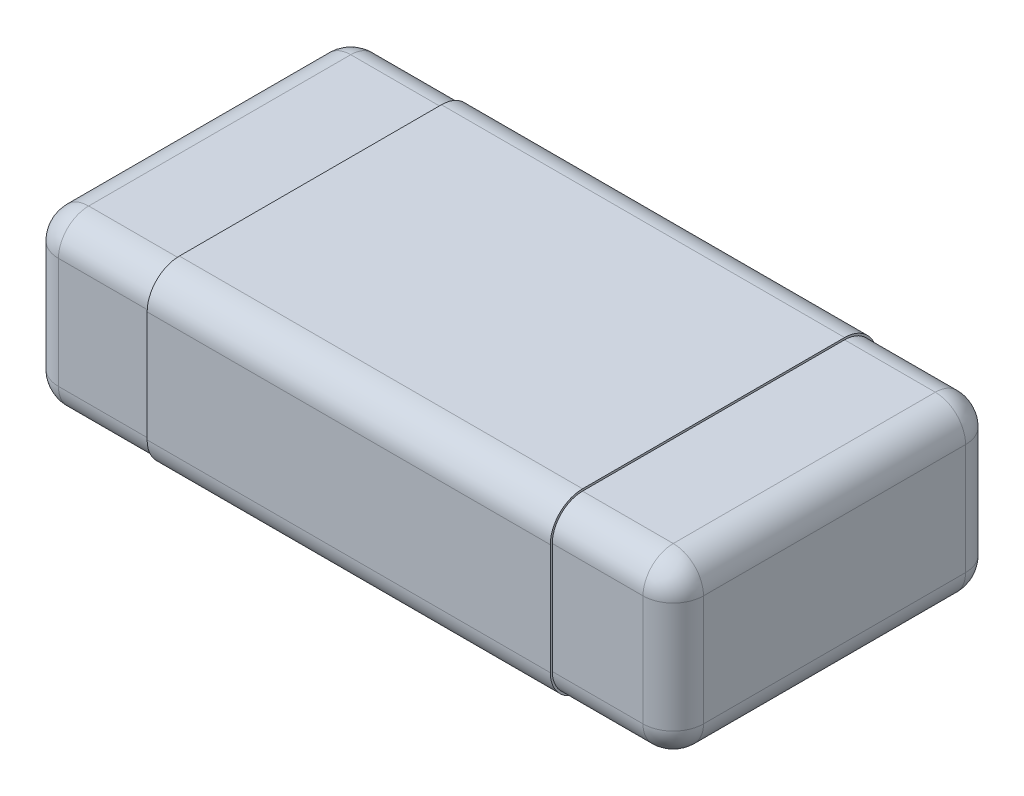
ISO-10303-21;
HEADER;
FILE_DESCRIPTION(('STEP AP214'),'2;1');
FILE_NAME('part.step','',(''),(''),'','','');
FILE_SCHEMA(('AUTOMOTIVE_DESIGN { 1 0 10303 214 1 1 1 1 }'));
ENDSEC;
DATA;
#1=APPLICATION_CONTEXT('core data for automotive mechanical design processes');
#2=APPLICATION_PROTOCOL_DEFINITION('international standard','automotive_design',2000,#1);
#3=PRODUCT_CONTEXT('',#1,'mechanical');
#4=PRODUCT('Part','Part','',(#3));
#5=PRODUCT_RELATED_PRODUCT_CATEGORY('part','',(#4));
#6=PRODUCT_DEFINITION_FORMATION('','',#4);
#7=PRODUCT_DEFINITION_CONTEXT('part definition',#1,'design');
#8=PRODUCT_DEFINITION('design','',#6,#7);
#9=PRODUCT_DEFINITION_SHAPE('','',#8);
#10=(LENGTH_UNIT() NAMED_UNIT(*) SI_UNIT(.MILLI.,.METRE.));
#11=(NAMED_UNIT(*) PLANE_ANGLE_UNIT() SI_UNIT($,.RADIAN.));
#12=(NAMED_UNIT(*) SI_UNIT($,.STERADIAN.) SOLID_ANGLE_UNIT());
#13=UNCERTAINTY_MEASURE_WITH_UNIT(LENGTH_MEASURE(1.E-05),#10,'distance_accuracy_value','');
#14=(GEOMETRIC_REPRESENTATION_CONTEXT(3) GLOBAL_UNCERTAINTY_ASSIGNED_CONTEXT((#13)) GLOBAL_UNIT_ASSIGNED_CONTEXT((#10,
#11,#12)) REPRESENTATION_CONTEXT('',''));
#15=CARTESIAN_POINT('',(0.,0.,0.));
#16=DIRECTION('',(0.,0.,1.));
#17=DIRECTION('',(1.,0.,0.));
#18=AXIS2_PLACEMENT_3D('',#15,#16,#17);
#19=CARTESIAN_POINT('',(-0.4,-0.7,-0.825));
#20=DIRECTION('',(1.,0.,0.));
#21=DIRECTION('',(0.,0.,-1.));
#22=AXIS2_PLACEMENT_3D('',#19,#20,#21);
#23=CYLINDRICAL_SURFACE('',#22,0.16);
#24=DIRECTION('',(1.,0.,0.));
#25=VECTOR('',#24,1.);
#26=CARTESIAN_POINT('',(-0.4,-0.7,-0.985));
#27=LINE('',#26,#25);
#28=CARTESIAN_POINT('',(-0.4,-0.7,-0.985));
#29=VERTEX_POINT('',#28);
#30=CARTESIAN_POINT('',(1.6,-0.7,-0.985));
#31=VERTEX_POINT('',#30);
#32=EDGE_CURVE('E323',#29,#31,#27,.T.);
#33=ORIENTED_EDGE('',*,*,#32,.T.);
#34=CARTESIAN_POINT('',(1.6,-0.7,-0.825));
#35=DIRECTION('',(1.,0.,0.));
#36=DIRECTION('',(0.,0.,-1.));
#37=AXIS2_PLACEMENT_3D('',#34,#35,#36);
#38=CIRCLE('',#37,0.16);
#39=CARTESIAN_POINT('',(1.6,-0.86,-0.825));
#40=VERTEX_POINT('',#39);
#41=EDGE_CURVE('E243',#40,#31,#38,.T.);
#42=ORIENTED_EDGE('',*,*,#41,.F.);
#43=DIRECTION('',(1.,0.,0.));
#44=VECTOR('',#43,1.);
#45=CARTESIAN_POINT('',(-0.4,-0.86,-0.825));
#46=LINE('',#45,#44);
#47=CARTESIAN_POINT('',(-0.4,-0.86,-0.825));
#48=VERTEX_POINT('',#47);
#49=EDGE_CURVE('E324',#48,#40,#46,.T.);
#50=ORIENTED_EDGE('',*,*,#49,.F.);
#51=CARTESIAN_POINT('',(-0.4,-0.7,-0.825));
#52=DIRECTION('',(1.,0.,0.));
#53=DIRECTION('',(0.,0.,-1.));
#54=AXIS2_PLACEMENT_3D('',#51,#52,#53);
#55=CIRCLE('',#54,0.16);
#56=EDGE_CURVE('E299',#48,#29,#55,.T.);
#57=ORIENTED_EDGE('',*,*,#56,.T.);
#58=EDGE_LOOP('',(#33,#42,#50,#57));
#59=FACE_BOUND('',#58,.T.);
#60=ADVANCED_FACE('F32',(#59),#23,.T.);
#61=CARTESIAN_POINT('',(-0.4,-0.86,-0.825));
#62=DIRECTION('',(0.,-1.,0.));
#63=DIRECTION('',(0.,0.,-1.));
#64=AXIS2_PLACEMENT_3D('',#61,#62,#63);
#65=PLANE('',#64);
#66=ORIENTED_EDGE('',*,*,#49,.T.);
#67=DIRECTION('',(0.,0.,-1.));
#68=VECTOR('',#67,1.);
#69=CARTESIAN_POINT('',(1.6,-0.86,-0.825));
#70=LINE('',#69,#68);
#71=CARTESIAN_POINT('',(1.6,-0.86,0.475));
#72=VERTEX_POINT('',#71);
#73=EDGE_CURVE('E280',#72,#40,#70,.T.);
#74=ORIENTED_EDGE('',*,*,#73,.F.);
#75=DIRECTION('',(1.,0.,0.));
#76=VECTOR('',#75,1.);
#77=CARTESIAN_POINT('',(-0.4,-0.86,0.475));
#78=LINE('',#77,#76);
#79=CARTESIAN_POINT('',(-0.4,-0.86,0.475));
#80=VERTEX_POINT('',#79);
#81=EDGE_CURVE('E327',#80,#72,#78,.T.);
#82=ORIENTED_EDGE('',*,*,#81,.F.);
#83=DIRECTION('',(0.,0.,-1.));
#84=VECTOR('',#83,1.);
#85=CARTESIAN_POINT('',(-0.4,-0.86,-0.825));
#86=LINE('',#85,#84);
#87=EDGE_CURVE('E320',#80,#48,#86,.T.);
#88=ORIENTED_EDGE('',*,*,#87,.T.);
#89=EDGE_LOOP('',(#66,#74,#82,#88));
#90=FACE_BOUND('',#89,.T.);
#91=ADVANCED_FACE('F608',(#90),#65,.T.);
#92=CARTESIAN_POINT('',(-0.4,-0.7,0.475));
#93=DIRECTION('',(1.,0.,0.));
#94=DIRECTION('',(0.,0.,-1.));
#95=AXIS2_PLACEMENT_3D('',#92,#93,#94);
#96=CYLINDRICAL_SURFACE('',#95,0.16);
#97=ORIENTED_EDGE('',*,*,#81,.T.);
#98=CARTESIAN_POINT('',(1.6,-0.7,0.475));
#99=DIRECTION('',(1.,0.,0.));
#100=DIRECTION('',(0.,0.,-1.));
#101=AXIS2_PLACEMENT_3D('',#98,#99,#100);
#102=CIRCLE('',#101,0.16);
#103=CARTESIAN_POINT('',(1.6,-0.7,0.635));
#104=VERTEX_POINT('',#103);
#105=EDGE_CURVE('E277',#104,#72,#102,.T.);
#106=ORIENTED_EDGE('',*,*,#105,.F.);
#107=DIRECTION('',(1.,0.,0.));
#108=VECTOR('',#107,1.);
#109=CARTESIAN_POINT('',(-0.4,-0.7,0.635));
#110=LINE('',#109,#108);
#111=CARTESIAN_POINT('',(-0.4,-0.7,0.635));
#112=VERTEX_POINT('',#111);
#113=EDGE_CURVE('E329',#112,#104,#110,.T.);
#114=ORIENTED_EDGE('',*,*,#113,.F.);
#115=CARTESIAN_POINT('',(-0.4,-0.7,0.475));
#116=DIRECTION('',(1.,0.,0.));
#117=DIRECTION('',(0.,0.,-1.));
#118=AXIS2_PLACEMENT_3D('',#115,#116,#117);
#119=CIRCLE('',#118,0.16);
#120=EDGE_CURVE('E317',#112,#80,#119,.T.);
#121=ORIENTED_EDGE('',*,*,#120,.T.);
#122=EDGE_LOOP('',(#97,#106,#114,#121));
#123=FACE_BOUND('',#122,.T.);
#124=ADVANCED_FACE('F614',(#123),#96,.T.);
#125=CARTESIAN_POINT('',(-0.4,-0.15,0.635));
#126=DIRECTION('',(0.,0.,1.));
#127=DIRECTION('',(0.,-1.,0.));
#128=AXIS2_PLACEMENT_3D('',#125,#126,#127);
#129=PLANE('',#128);
#130=ORIENTED_EDGE('',*,*,#113,.T.);
#131=DIRECTION('',(0.,-1.,0.));
#132=VECTOR('',#131,1.);
#133=CARTESIAN_POINT('',(1.6,-0.15,0.635));
#134=LINE('',#133,#132);
#135=CARTESIAN_POINT('',(1.6,-0.15,0.635));
#136=VERTEX_POINT('',#135);
#137=EDGE_CURVE('E274',#136,#104,#134,.T.);
#138=ORIENTED_EDGE('',*,*,#137,.F.);
#139=DIRECTION('',(1.,0.,0.));
#140=VECTOR('',#139,1.);
#141=CARTESIAN_POINT('',(-0.4,-0.15,0.635));
#142=LINE('',#141,#140);
#143=CARTESIAN_POINT('',(-0.4,-0.15,0.635));
#144=VERTEX_POINT('',#143);
#145=EDGE_CURVE('E343',#144,#136,#142,.T.);
#146=ORIENTED_EDGE('',*,*,#145,.F.);
#147=DIRECTION('',(0.,-1.,0.));
#148=VECTOR('',#147,1.);
#149=CARTESIAN_POINT('',(-0.4,-0.15,0.635));
#150=LINE('',#149,#148);
#151=EDGE_CURVE('E314',#144,#112,#150,.T.);
#152=ORIENTED_EDGE('',*,*,#151,.T.);
#153=EDGE_LOOP('',(#130,#138,#146,#152));
#154=FACE_BOUND('',#153,.T.);
#155=ADVANCED_FACE('F770',(#154),#129,.T.);
#156=CARTESIAN_POINT('',(-0.4,-0.15,0.475));
#157=DIRECTION('',(1.,0.,0.));
#158=DIRECTION('',(0.,0.,-1.));
#159=AXIS2_PLACEMENT_3D('',#156,#157,#158);
#160=CYLINDRICAL_SURFACE('',#159,0.16);
#161=ORIENTED_EDGE('',*,*,#145,.T.);
#162=CARTESIAN_POINT('',(1.6,-0.15,0.475));
#163=DIRECTION('',(1.,0.,0.));
#164=DIRECTION('',(0.,0.,-1.));
#165=AXIS2_PLACEMENT_3D('',#162,#163,#164);
#166=CIRCLE('',#165,0.16);
#167=CARTESIAN_POINT('',(1.6,0.00999999999999981,0.475));
#168=VERTEX_POINT('',#167);
#169=EDGE_CURVE('E271',#168,#136,#166,.T.);
#170=ORIENTED_EDGE('',*,*,#169,.F.);
#171=DIRECTION('',(1.,0.,0.));
#172=VECTOR('',#171,1.);
#173=CARTESIAN_POINT('',(-0.4,0.00999999999999981,0.475));
#174=LINE('',#173,#172);
#175=CARTESIAN_POINT('',(-0.4,0.00999999999999981,0.475));
#176=VERTEX_POINT('',#175);
#177=EDGE_CURVE('E339',#176,#168,#174,.T.);
#178=ORIENTED_EDGE('',*,*,#177,.F.);
#179=CARTESIAN_POINT('',(-0.4,-0.15,0.475));
#180=DIRECTION('',(1.,0.,0.));
#181=DIRECTION('',(0.,0.,-1.));
#182=AXIS2_PLACEMENT_3D('',#179,#180,#181);
#183=CIRCLE('',#182,0.16);
#184=EDGE_CURVE('E311',#176,#144,#183,.T.);
#185=ORIENTED_EDGE('',*,*,#184,.T.);
#186=EDGE_LOOP('',(#161,#170,#178,#185));
#187=FACE_BOUND('',#186,.T.);
#188=ADVANCED_FACE('F762',(#187),#160,.T.);
#189=CARTESIAN_POINT('',(-0.4,0.00999999999999997,-0.825));
#190=DIRECTION('',(0.,1.,0.));
#191=DIRECTION('',(0.,0.,1.));
#192=AXIS2_PLACEMENT_3D('',#189,#190,#191);
#193=PLANE('',#192);
#194=ORIENTED_EDGE('',*,*,#177,.T.);
#195=DIRECTION('',(0.,0.,1.));
#196=VECTOR('',#195,1.);
#197=CARTESIAN_POINT('',(1.6,0.00999999999999997,-0.825));
#198=LINE('',#197,#196);
#199=CARTESIAN_POINT('',(1.6,0.00999999999999992,-0.825));
#200=VERTEX_POINT('',#199);
#201=EDGE_CURVE('E268',#200,#168,#198,.T.);
#202=ORIENTED_EDGE('',*,*,#201,.F.);
#203=DIRECTION('',(1.,0.,0.));
#204=VECTOR('',#203,1.);
#205=CARTESIAN_POINT('',(-0.4,0.00999999999999992,-0.825));
#206=LINE('',#205,#204);
#207=CARTESIAN_POINT('',(-0.4,0.00999999999999992,-0.825));
#208=VERTEX_POINT('',#207);
#209=EDGE_CURVE('E335',#208,#200,#206,.T.);
#210=ORIENTED_EDGE('',*,*,#209,.F.);
#211=DIRECTION('',(0.,0.,1.));
#212=VECTOR('',#211,1.);
#213=CARTESIAN_POINT('',(-0.4,0.00999999999999997,-0.825));
#214=LINE('',#213,#212);
#215=EDGE_CURVE('E308',#208,#176,#214,.T.);
#216=ORIENTED_EDGE('',*,*,#215,.T.);
#217=EDGE_LOOP('',(#194,#202,#210,#216));
#218=FACE_BOUND('',#217,.T.);
#219=ADVANCED_FACE('F755',(#218),#193,.T.);
#220=CARTESIAN_POINT('',(-0.4,-0.15,-0.825));
#221=DIRECTION('',(1.,0.,0.));
#222=DIRECTION('',(0.,0.,-1.));
#223=AXIS2_PLACEMENT_3D('',#220,#221,#222);
#224=CYLINDRICAL_SURFACE('',#223,0.16);
#225=ORIENTED_EDGE('',*,*,#209,.T.);
#226=CARTESIAN_POINT('',(1.6,-0.15,-0.825));
#227=DIRECTION('',(1.,0.,0.));
#228=DIRECTION('',(0.,0.,-1.));
#229=AXIS2_PLACEMENT_3D('',#226,#227,#228);
#230=CIRCLE('',#229,0.16);
#231=CARTESIAN_POINT('',(1.6,-0.15,-0.985));
#232=VERTEX_POINT('',#231);
#233=EDGE_CURVE('E265',#232,#200,#230,.T.);
#234=ORIENTED_EDGE('',*,*,#233,.F.);
#235=DIRECTION('',(1.,0.,0.));
#236=VECTOR('',#235,1.);
#237=CARTESIAN_POINT('',(-0.4,-0.15,-0.985));
#238=LINE('',#237,#236);
#239=CARTESIAN_POINT('',(-0.4,-0.15,-0.985));
#240=VERTEX_POINT('',#239);
#241=EDGE_CURVE('E331',#240,#232,#238,.T.);
#242=ORIENTED_EDGE('',*,*,#241,.F.);
#243=CARTESIAN_POINT('',(-0.4,-0.15,-0.825));
#244=DIRECTION('',(1.,0.,0.));
#245=DIRECTION('',(0.,0.,-1.));
#246=AXIS2_PLACEMENT_3D('',#243,#244,#245);
#247=CIRCLE('',#246,0.16);
#248=EDGE_CURVE('E305',#240,#208,#247,.T.);
#249=ORIENTED_EDGE('',*,*,#248,.T.);
#250=EDGE_LOOP('',(#225,#234,#242,#249));
#251=FACE_BOUND('',#250,.T.);
#252=ADVANCED_FACE('F748',(#251),#224,.T.);
#253=CARTESIAN_POINT('',(-0.4,-0.7,-0.985));
#254=DIRECTION('',(0.,0.,-1.));
#255=DIRECTION('',(-1.,0.,0.));
#256=AXIS2_PLACEMENT_3D('',#253,#254,#255);
#257=PLANE('',#256);
#258=ORIENTED_EDGE('',*,*,#241,.T.);
#259=DIRECTION('',(0.,1.,0.));
#260=VECTOR('',#259,1.);
#261=CARTESIAN_POINT('',(1.6,-0.7,-0.985));
#262=LINE('',#261,#260);
#263=EDGE_CURVE('E262',#31,#232,#262,.T.);
#264=ORIENTED_EDGE('',*,*,#263,.F.);
#265=ORIENTED_EDGE('',*,*,#32,.F.);
#266=DIRECTION('',(0.,1.,0.));
#267=VECTOR('',#266,1.);
#268=CARTESIAN_POINT('',(-0.4,-0.7,-0.985));
#269=LINE('',#268,#267);
#270=EDGE_CURVE('E302',#29,#240,#269,.T.);
#271=ORIENTED_EDGE('',*,*,#270,.T.);
#272=EDGE_LOOP('',(#258,#264,#265,#271));
#273=FACE_BOUND('',#272,.T.);
#274=ADVANCED_FACE('F619',(#273),#257,.T.);
#275=CARTESIAN_POINT('',(-0.4,-0.7,-0.825));
#276=DIRECTION('',(1.,0.,0.));
#277=DIRECTION('',(0.,0.,-1.));
#278=AXIS2_PLACEMENT_3D('',#275,#276,#277);
#279=PLANE('',#278);
#280=DIRECTION('',(0.,0.,-1.));
#281=VECTOR('',#280,1.);
#282=CARTESIAN_POINT('',(-0.4,-0.85,-0.825));
#283=LINE('',#282,#281);
#284=CARTESIAN_POINT('',(-0.4,-0.85,0.475));
#285=VERTEX_POINT('',#284);
#286=CARTESIAN_POINT('',(-0.4,-0.85,-0.825));
#287=VERTEX_POINT('',#286);
#288=EDGE_CURVE('E297',#285,#287,#283,.T.);
#289=ORIENTED_EDGE('',*,*,#288,.T.);
#290=CARTESIAN_POINT('',(-0.4,-0.7,-0.825));
#291=DIRECTION('',(1.,0.,0.));
#292=DIRECTION('',(0.,0.,-1.));
#293=AXIS2_PLACEMENT_3D('',#290,#291,#292);
#294=CIRCLE('',#293,0.15);
#295=CARTESIAN_POINT('',(-0.4,-0.7,-0.975));
#296=VERTEX_POINT('',#295);
#297=EDGE_CURVE('E283',#287,#296,#294,.T.);
#298=ORIENTED_EDGE('',*,*,#297,.T.);
#299=DIRECTION('',(0.,1.,0.));
#300=VECTOR('',#299,1.);
#301=CARTESIAN_POINT('',(-0.4,-0.7,-0.975));
#302=LINE('',#301,#300);
#303=CARTESIAN_POINT('',(-0.4,-0.15,-0.975));
#304=VERTEX_POINT('',#303);
#305=EDGE_CURVE('E285',#296,#304,#302,.T.);
#306=ORIENTED_EDGE('',*,*,#305,.T.);
#307=CARTESIAN_POINT('',(-0.4,-0.15,-0.825));
#308=DIRECTION('',(1.,0.,0.));
#309=DIRECTION('',(0.,0.,-1.));
#310=AXIS2_PLACEMENT_3D('',#307,#308,#309);
#311=CIRCLE('',#310,0.15);
#312=CARTESIAN_POINT('',(-0.4,0.,-0.825));
#313=VERTEX_POINT('',#312);
#314=EDGE_CURVE('E287',#304,#313,#311,.T.);
#315=ORIENTED_EDGE('',*,*,#314,.T.);
#316=DIRECTION('',(0.,0.,1.));
#317=VECTOR('',#316,1.);
#318=CARTESIAN_POINT('',(-0.4,0.,-0.825));
#319=LINE('',#318,#317);
#320=CARTESIAN_POINT('',(-0.4,0.,0.475));
#321=VERTEX_POINT('',#320);
#322=EDGE_CURVE('E289',#313,#321,#319,.T.);
#323=ORIENTED_EDGE('',*,*,#322,.T.);
#324=CARTESIAN_POINT('',(-0.4,-0.15,0.475));
#325=DIRECTION('',(1.,0.,0.));
#326=DIRECTION('',(0.,0.,-1.));
#327=AXIS2_PLACEMENT_3D('',#324,#325,#326);
#328=CIRCLE('',#327,0.15);
#329=CARTESIAN_POINT('',(-0.4,-0.15,0.625));
#330=VERTEX_POINT('',#329);
#331=EDGE_CURVE('E291',#321,#330,#328,.T.);
#332=ORIENTED_EDGE('',*,*,#331,.T.);
#333=DIRECTION('',(0.,-1.,0.));
#334=VECTOR('',#333,1.);
#335=CARTESIAN_POINT('',(-0.4,-0.15,0.625));
#336=LINE('',#335,#334);
#337=CARTESIAN_POINT('',(-0.4,-0.7,0.625));
#338=VERTEX_POINT('',#337);
#339=EDGE_CURVE('E293',#330,#338,#336,.T.);
#340=ORIENTED_EDGE('',*,*,#339,.T.);
#341=CARTESIAN_POINT('',(-0.4,-0.7,0.475));
#342=DIRECTION('',(1.,0.,0.));
#343=DIRECTION('',(0.,0.,-1.));
#344=AXIS2_PLACEMENT_3D('',#341,#342,#343);
#345=CIRCLE('',#344,0.15);
#346=EDGE_CURVE('E295',#338,#285,#345,.T.);
#347=ORIENTED_EDGE('',*,*,#346,.T.);
#348=EDGE_LOOP('',(#289,#298,#306,#315,#323,#332,#340,#347));
#349=FACE_BOUND('',#348,.T.);
#350=ORIENTED_EDGE('',*,*,#56,.F.);
#351=ORIENTED_EDGE('',*,*,#87,.F.);
#352=ORIENTED_EDGE('',*,*,#120,.F.);
#353=ORIENTED_EDGE('',*,*,#151,.F.);
#354=ORIENTED_EDGE('',*,*,#184,.F.);
#355=ORIENTED_EDGE('',*,*,#215,.F.);
#356=ORIENTED_EDGE('',*,*,#248,.F.);
#357=ORIENTED_EDGE('',*,*,#270,.F.);
#358=EDGE_LOOP('',(#350,#351,#352,#353,#354,#355,#356,#357));
#359=FACE_BOUND('',#358,.T.);
#360=ADVANCED_FACE('F514',(#349,#359),#279,.F.);
#361=CARTESIAN_POINT('',(-1.,-0.85,-0.975));
#362=DIRECTION('',(-1.,0.,0.));
#363=DIRECTION('',(0.,0.,1.));
#364=AXIS2_PLACEMENT_3D('',#361,#362,#363);
#365=PLANE('',#364);
#366=DIRECTION('',(0.,0.,1.));
#367=VECTOR('',#366,1.);
#368=CARTESIAN_POINT('',(-1.,-0.15,-0.975));
#369=LINE('',#368,#367);
#370=CARTESIAN_POINT('',(-1.,-0.15,0.475));
#371=VERTEX_POINT('',#370);
#372=CARTESIAN_POINT('',(-1.,-0.15,-0.825));
#373=VERTEX_POINT('',#372);
#374=EDGE_CURVE('E452',#371,#373,#369,.F.);
#375=ORIENTED_EDGE('',*,*,#374,.T.);
#376=DIRECTION('',(0.,1.,0.));
#377=VECTOR('',#376,1.);
#378=CARTESIAN_POINT('',(-1.,-0.85,-0.825));
#379=LINE('',#378,#377);
#380=CARTESIAN_POINT('',(-1.,-0.7,-0.825));
#381=VERTEX_POINT('',#380);
#382=EDGE_CURVE('E456',#373,#381,#379,.F.);
#383=ORIENTED_EDGE('',*,*,#382,.T.);
#384=DIRECTION('',(0.,0.,1.));
#385=VECTOR('',#384,1.);
#386=CARTESIAN_POINT('',(-1.,-0.7,0.625));
#387=LINE('',#386,#385);
#388=CARTESIAN_POINT('',(-1.,-0.7,0.475));
#389=VERTEX_POINT('',#388);
#390=EDGE_CURVE('E454',#381,#389,#387,.T.);
#391=ORIENTED_EDGE('',*,*,#390,.T.);
#392=DIRECTION('',(0.,1.,0.));
#393=VECTOR('',#392,1.);
#394=CARTESIAN_POINT('',(-1.,-0.85,0.475));
#395=LINE('',#394,#393);
#396=EDGE_CURVE('E450',#389,#371,#395,.T.);
#397=ORIENTED_EDGE('',*,*,#396,.T.);
#398=EDGE_LOOP('',(#375,#383,#391,#397));
#399=FACE_BOUND('',#398,.T.);
#400=ADVANCED_FACE('F637',(#399),#365,.T.);
#401=CARTESIAN_POINT('',(-0.85,-0.85,-0.825));
#402=DIRECTION('',(0.,1.,0.));
#403=DIRECTION('',(0.,0.,1.));
#404=AXIS2_PLACEMENT_3D('',#401,#402,#403);
#405=CYLINDRICAL_SURFACE('',#404,0.15);
#406=CARTESIAN_POINT('',(-0.85,-0.15,-0.825));
#407=DIRECTION('',(0.,1.,0.));
#408=DIRECTION('',(0.,0.,1.));
#409=AXIS2_PLACEMENT_3D('',#406,#407,#408);
#410=CIRCLE('',#409,0.15);
#411=CARTESIAN_POINT('',(-0.85,-0.15,-0.975));
#412=VERTEX_POINT('',#411);
#413=EDGE_CURVE('E386',#373,#412,#410,.F.);
#414=ORIENTED_EDGE('',*,*,#413,.T.);
#415=DIRECTION('',(0.,1.,0.));
#416=VECTOR('',#415,1.);
#417=CARTESIAN_POINT('',(-0.85,-0.85,-0.975));
#418=LINE('',#417,#416);
#419=CARTESIAN_POINT('',(-0.85,-0.7,-0.975));
#420=VERTEX_POINT('',#419);
#421=EDGE_CURVE('E443',#420,#412,#418,.T.);
#422=ORIENTED_EDGE('',*,*,#421,.F.);
#423=CARTESIAN_POINT('',(-0.85,-0.7,-0.825));
#424=DIRECTION('',(0.,-1.,0.));
#425=DIRECTION('',(0.,0.,-1.));
#426=AXIS2_PLACEMENT_3D('',#423,#424,#425);
#427=CIRCLE('',#426,0.15);
#428=EDGE_CURVE('E375',#381,#420,#427,.T.);
#429=ORIENTED_EDGE('',*,*,#428,.F.);
#430=ORIENTED_EDGE('',*,*,#382,.F.);
#431=EDGE_LOOP('',(#414,#422,#429,#430));
#432=FACE_BOUND('',#431,.T.);
#433=ADVANCED_FACE('F640',(#432),#405,.T.);
#434=CARTESIAN_POINT('',(-0.85,-0.85,0.475));
#435=DIRECTION('',(0.,1.,0.));
#436=DIRECTION('',(0.,0.,1.));
#437=AXIS2_PLACEMENT_3D('',#434,#435,#436);
#438=CYLINDRICAL_SURFACE('',#437,0.15);
#439=CARTESIAN_POINT('',(-0.85,-0.15,0.475));
#440=DIRECTION('',(0.,1.,0.));
#441=DIRECTION('',(0.,0.,1.));
#442=AXIS2_PLACEMENT_3D('',#439,#440,#441);
#443=CIRCLE('',#442,0.15);
#444=CARTESIAN_POINT('',(-0.85,-0.15,0.625));
#445=VERTEX_POINT('',#444);
#446=EDGE_CURVE('E418',#445,#371,#443,.F.);
#447=ORIENTED_EDGE('',*,*,#446,.T.);
#448=ORIENTED_EDGE('',*,*,#396,.F.);
#449=CARTESIAN_POINT('',(-0.85,-0.7,0.475));
#450=DIRECTION('',(0.,-1.,0.));
#451=DIRECTION('',(0.,0.,-1.));
#452=AXIS2_PLACEMENT_3D('',#449,#450,#451);
#453=CIRCLE('',#452,0.15);
#454=CARTESIAN_POINT('',(-0.85,-0.7,0.625));
#455=VERTEX_POINT('',#454);
#456=EDGE_CURVE('E397',#455,#389,#453,.T.);
#457=ORIENTED_EDGE('',*,*,#456,.F.);
#458=DIRECTION('',(0.,1.,0.));
#459=VECTOR('',#458,1.);
#460=CARTESIAN_POINT('',(-0.85,-0.85,0.625));
#461=LINE('',#460,#459);
#462=EDGE_CURVE('E362',#445,#455,#461,.F.);
#463=ORIENTED_EDGE('',*,*,#462,.F.);
#464=EDGE_LOOP('',(#447,#448,#457,#463));
#465=FACE_BOUND('',#464,.T.);
#466=ADVANCED_FACE('F528',(#465),#438,.T.);
#467=CARTESIAN_POINT('',(-0.85,-0.7,-0.975));
#468=DIRECTION('',(0.,0.,-1.));
#469=DIRECTION('',(-1.,0.,0.));
#470=AXIS2_PLACEMENT_3D('',#467,#468,#469);
#471=CYLINDRICAL_SURFACE('',#470,0.15);
#472=CARTESIAN_POINT('',(-0.85,-0.7,0.475));
#473=DIRECTION('',(0.,0.,1.));
#474=DIRECTION('',(0.,-1.,0.));
#475=AXIS2_PLACEMENT_3D('',#472,#473,#474);
#476=CIRCLE('',#475,0.15);
#477=CARTESIAN_POINT('',(-0.85,-0.85,0.475));
#478=VERTEX_POINT('',#477);
#479=EDGE_CURVE('E383',#478,#389,#476,.F.);
#480=ORIENTED_EDGE('',*,*,#479,.T.);
#481=ORIENTED_EDGE('',*,*,#390,.F.);
#482=CARTESIAN_POINT('',(-0.85,-0.7,-0.825));
#483=DIRECTION('',(0.,0.,-1.));
#484=DIRECTION('',(-1.,0.,0.));
#485=AXIS2_PLACEMENT_3D('',#482,#483,#484);
#486=CIRCLE('',#485,0.15);
#487=CARTESIAN_POINT('',(-0.85,-0.85,-0.825));
#488=VERTEX_POINT('',#487);
#489=EDGE_CURVE('E373',#488,#381,#486,.T.);
#490=ORIENTED_EDGE('',*,*,#489,.F.);
#491=DIRECTION('',(0.,0.,1.));
#492=VECTOR('',#491,1.);
#493=CARTESIAN_POINT('',(-0.85,-0.85,-0.975));
#494=LINE('',#493,#492);
#495=EDGE_CURVE('E233',#478,#488,#494,.F.);
#496=ORIENTED_EDGE('',*,*,#495,.F.);
#497=EDGE_LOOP('',(#480,#481,#490,#496));
#498=FACE_BOUND('',#497,.T.);
#499=ADVANCED_FACE('F535',(#498),#471,.T.);
#500=CARTESIAN_POINT('',(-0.85,-0.15,0.));
#501=DIRECTION('',(0.,0.,1.));
#502=DIRECTION('',(1.,0.,0.));
#503=AXIS2_PLACEMENT_3D('',#500,#501,#502);
#504=CYLINDRICAL_SURFACE('',#503,0.15);
#505=CARTESIAN_POINT('',(-0.85,-0.15,0.475));
#506=DIRECTION('',(0.,0.,1.));
#507=DIRECTION('',(1.,0.,0.));
#508=AXIS2_PLACEMENT_3D('',#505,#506,#507);
#509=CIRCLE('',#508,0.15);
#510=CARTESIAN_POINT('',(-0.85,0.,0.475));
#511=VERTEX_POINT('',#510);
#512=EDGE_CURVE('E421',#371,#511,#509,.F.);
#513=ORIENTED_EDGE('',*,*,#512,.T.);
#514=DIRECTION('',(0.,0.,1.));
#515=VECTOR('',#514,1.);
#516=CARTESIAN_POINT('',(-0.85,0.,0.));
#517=LINE('',#516,#515);
#518=CARTESIAN_POINT('',(-0.85,0.,-0.825));
#519=VERTEX_POINT('',#518);
#520=EDGE_CURVE('E473',#519,#511,#517,.T.);
#521=ORIENTED_EDGE('',*,*,#520,.F.);
#522=CARTESIAN_POINT('',(-0.85,-0.15,-0.825));
#523=DIRECTION('',(0.,0.,-1.));
#524=DIRECTION('',(-1.,0.,0.));
#525=AXIS2_PLACEMENT_3D('',#522,#523,#524);
#526=CIRCLE('',#525,0.15);
#527=EDGE_CURVE('E400',#373,#519,#526,.T.);
#528=ORIENTED_EDGE('',*,*,#527,.F.);
#529=ORIENTED_EDGE('',*,*,#374,.F.);
#530=EDGE_LOOP('',(#513,#521,#528,#529));
#531=FACE_BOUND('',#530,.T.);
#532=ADVANCED_FACE('F501',(#531),#504,.T.);
#533=CARTESIAN_POINT('',(-0.85,-0.15,0.475));
#534=DIRECTION('',(0.,0.,1.));
#535=DIRECTION('',(1.,0.,0.));
#536=AXIS2_PLACEMENT_3D('',#533,#534,#535);
#537=SPHERICAL_SURFACE('',#536,0.15);
#538=ORIENTED_EDGE('',*,*,#446,.F.);
#539=CARTESIAN_POINT('',(-0.85,-0.15,0.475));
#540=DIRECTION('',(-1.,0.,0.));
#541=DIRECTION('',(0.,0.,1.));
#542=AXIS2_PLACEMENT_3D('',#539,#540,#541);
#543=CIRCLE('',#542,0.15);
#544=EDGE_CURVE('E430',#445,#511,#543,.T.);
#545=ORIENTED_EDGE('',*,*,#544,.T.);
#546=ORIENTED_EDGE('',*,*,#512,.F.);
#547=EDGE_LOOP('',(#538,#545,#546));
#548=FACE_BOUND('',#547,.T.);
#549=ADVANCED_FACE('F505',(#548),#537,.T.);
#550=CARTESIAN_POINT('',(-0.85,-0.15,-0.825));
#551=DIRECTION('',(0.,0.,1.));
#552=DIRECTION('',(1.,0.,0.));
#553=AXIS2_PLACEMENT_3D('',#550,#551,#552);
#554=SPHERICAL_SURFACE('',#553,0.15);
#555=ORIENTED_EDGE('',*,*,#527,.T.);
#556=CARTESIAN_POINT('',(-0.85,-0.15,-0.825));
#557=DIRECTION('',(-1.,0.,0.));
#558=DIRECTION('',(0.,0.,1.));
#559=AXIS2_PLACEMENT_3D('',#556,#557,#558);
#560=CIRCLE('',#559,0.15);
#561=EDGE_CURVE('E403',#519,#412,#560,.T.);
#562=ORIENTED_EDGE('',*,*,#561,.T.);
#563=ORIENTED_EDGE('',*,*,#413,.F.);
#564=EDGE_LOOP('',(#555,#562,#563));
#565=FACE_BOUND('',#564,.T.);
#566=ADVANCED_FACE('F495',(#565),#554,.T.);
#567=CARTESIAN_POINT('',(-0.85,-0.7,0.475));
#568=DIRECTION('',(0.,0.,1.));
#569=DIRECTION('',(1.,0.,0.));
#570=AXIS2_PLACEMENT_3D('',#567,#568,#569);
#571=SPHERICAL_SURFACE('',#570,0.15);
#572=CARTESIAN_POINT('',(-0.85,-0.7,0.475));
#573=DIRECTION('',(-1.,0.,0.));
#574=DIRECTION('',(0.,0.,1.));
#575=AXIS2_PLACEMENT_3D('',#572,#573,#574);
#576=CIRCLE('',#575,0.15);
#577=EDGE_CURVE('E394',#478,#455,#576,.T.);
#578=ORIENTED_EDGE('',*,*,#577,.T.);
#579=ORIENTED_EDGE('',*,*,#456,.T.);
#580=ORIENTED_EDGE('',*,*,#479,.F.);
#581=EDGE_LOOP('',(#578,#579,#580));
#582=FACE_BOUND('',#581,.T.);
#583=ADVANCED_FACE('F530',(#582),#571,.T.);
#584=CARTESIAN_POINT('',(-0.85,-0.7,-0.825));
#585=DIRECTION('',(0.,0.,1.));
#586=DIRECTION('',(1.,0.,0.));
#587=AXIS2_PLACEMENT_3D('',#584,#585,#586);
#588=SPHERICAL_SURFACE('',#587,0.15);
#589=ORIENTED_EDGE('',*,*,#489,.T.);
#590=ORIENTED_EDGE('',*,*,#428,.T.);
#591=CARTESIAN_POINT('',(-0.85,-0.7,-0.825));
#592=DIRECTION('',(-1.,0.,0.));
#593=DIRECTION('',(0.,-1.,0.));
#594=AXIS2_PLACEMENT_3D('',#591,#592,#593);
#595=CIRCLE('',#594,0.15);
#596=EDGE_CURVE('E326',#488,#420,#595,.F.);
#597=ORIENTED_EDGE('',*,*,#596,.F.);
#598=EDGE_LOOP('',(#589,#590,#597));
#599=FACE_BOUND('',#598,.T.);
#600=ADVANCED_FACE('F644',(#599),#588,.T.);
#601=CARTESIAN_POINT('',(0.,-0.15,-0.825));
#602=DIRECTION('',(-1.,0.,0.));
#603=DIRECTION('',(0.,0.,1.));
#604=AXIS2_PLACEMENT_3D('',#601,#602,#603);
#605=CYLINDRICAL_SURFACE('',#604,0.15);
#606=DIRECTION('',(-1.,0.,0.));
#607=VECTOR('',#606,1.);
#608=CARTESIAN_POINT('',(0.,0.,-0.825));
#609=LINE('',#608,#607);
#610=EDGE_CURVE('E475',#313,#519,#609,.T.);
#611=ORIENTED_EDGE('',*,*,#610,.F.);
#612=ORIENTED_EDGE('',*,*,#314,.F.);
#613=DIRECTION('',(-1.,0.,0.));
#614=VECTOR('',#613,1.);
#615=CARTESIAN_POINT('',(2.2,-0.15,-0.975));
#616=LINE('',#615,#614);
#617=EDGE_CURVE('E352',#412,#304,#616,.F.);
#618=ORIENTED_EDGE('',*,*,#617,.F.);
#619=ORIENTED_EDGE('',*,*,#561,.F.);
#620=EDGE_LOOP('',(#611,#612,#618,#619));
#621=FACE_BOUND('',#620,.T.);
#622=ADVANCED_FACE('F500',(#621),#605,.T.);
#623=CARTESIAN_POINT('',(0.,-0.15,0.475));
#624=DIRECTION('',(1.,0.,0.));
#625=DIRECTION('',(0.,0.,-1.));
#626=AXIS2_PLACEMENT_3D('',#623,#624,#625);
#627=CYLINDRICAL_SURFACE('',#626,0.15);
#628=DIRECTION('',(1.,0.,0.));
#629=VECTOR('',#628,1.);
#630=CARTESIAN_POINT('',(-1.,-0.15,0.625));
#631=LINE('',#630,#629);
#632=EDGE_CURVE('E363',#330,#445,#631,.F.);
#633=ORIENTED_EDGE('',*,*,#632,.F.);
#634=ORIENTED_EDGE('',*,*,#331,.F.);
#635=DIRECTION('',(1.,0.,0.));
#636=VECTOR('',#635,1.);
#637=CARTESIAN_POINT('',(0.,0.,0.475));
#638=LINE('',#637,#636);
#639=EDGE_CURVE('E467',#511,#321,#638,.T.);
#640=ORIENTED_EDGE('',*,*,#639,.F.);
#641=ORIENTED_EDGE('',*,*,#544,.F.);
#642=EDGE_LOOP('',(#633,#634,#640,#641));
#643=FACE_BOUND('',#642,.T.);
#644=ADVANCED_FACE('F510',(#643),#627,.T.);
#645=CARTESIAN_POINT('',(0.,0.,0.));
#646=DIRECTION('',(0.,1.,0.));
#647=DIRECTION('',(0.,0.,1.));
#648=AXIS2_PLACEMENT_3D('',#645,#646,#647);
#649=PLANE('',#648);
#650=ORIENTED_EDGE('',*,*,#639,.T.);
#651=ORIENTED_EDGE('',*,*,#322,.F.);
#652=ORIENTED_EDGE('',*,*,#610,.T.);
#653=ORIENTED_EDGE('',*,*,#520,.T.);
#654=EDGE_LOOP('',(#650,#651,#652,#653));
#655=FACE_BOUND('',#654,.T.);
#656=ADVANCED_FACE('F486',(#655),#649,.T.);
#657=CARTESIAN_POINT('',(2.2,-0.7,-0.825));
#658=DIRECTION('',(1.,0.,0.));
#659=DIRECTION('',(0.,0.,-1.));
#660=AXIS2_PLACEMENT_3D('',#657,#658,#659);
#661=CYLINDRICAL_SURFACE('',#660,0.15);
#662=DIRECTION('',(-1.,0.,0.));
#663=VECTOR('',#662,1.);
#664=CARTESIAN_POINT('',(-1.,-0.7,-0.975));
#665=LINE('',#664,#663);
#666=EDGE_CURVE('E439',#296,#420,#665,.T.);
#667=ORIENTED_EDGE('',*,*,#666,.F.);
#668=ORIENTED_EDGE('',*,*,#297,.F.);
#669=DIRECTION('',(-1.,0.,0.));
#670=VECTOR('',#669,1.);
#671=CARTESIAN_POINT('',(2.2,-0.85,-0.825));
#672=LINE('',#671,#670);
#673=EDGE_CURVE('E232',#488,#287,#672,.F.);
#674=ORIENTED_EDGE('',*,*,#673,.F.);
#675=ORIENTED_EDGE('',*,*,#596,.T.);
#676=EDGE_LOOP('',(#667,#668,#674,#675));
#677=FACE_BOUND('',#676,.T.);
#678=ADVANCED_FACE('F544',(#677),#661,.T.);
#679=CARTESIAN_POINT('',(-1.,-0.7,0.475));
#680=DIRECTION('',(-1.,0.,0.));
#681=DIRECTION('',(0.,0.,1.));
#682=AXIS2_PLACEMENT_3D('',#679,#680,#681);
#683=CYLINDRICAL_SURFACE('',#682,0.15);
#684=DIRECTION('',(1.,0.,0.));
#685=VECTOR('',#684,1.);
#686=CARTESIAN_POINT('',(-1.,-0.85,0.475));
#687=LINE('',#686,#685);
#688=EDGE_CURVE('E438',#285,#478,#687,.F.);
#689=ORIENTED_EDGE('',*,*,#688,.F.);
#690=ORIENTED_EDGE('',*,*,#346,.F.);
#691=DIRECTION('',(1.,0.,0.));
#692=VECTOR('',#691,1.);
#693=CARTESIAN_POINT('',(2.2,-0.7,0.625));
#694=LINE('',#693,#692);
#695=EDGE_CURVE('E11',#455,#338,#694,.T.);
#696=ORIENTED_EDGE('',*,*,#695,.F.);
#697=ORIENTED_EDGE('',*,*,#577,.F.);
#698=EDGE_LOOP('',(#689,#690,#696,#697));
#699=FACE_BOUND('',#698,.T.);
#700=ADVANCED_FACE('F524',(#699),#683,.T.);
#701=CARTESIAN_POINT('',(0.,-0.85,0.));
#702=DIRECTION('',(0.,1.,0.));
#703=DIRECTION('',(0.,0.,1.));
#704=AXIS2_PLACEMENT_3D('',#701,#702,#703);
#705=PLANE('',#704);
#706=ORIENTED_EDGE('',*,*,#288,.F.);
#707=ORIENTED_EDGE('',*,*,#688,.T.);
#708=ORIENTED_EDGE('',*,*,#495,.T.);
#709=ORIENTED_EDGE('',*,*,#673,.T.);
#710=EDGE_LOOP('',(#706,#707,#708,#709));
#711=FACE_BOUND('',#710,.T.);
#712=ADVANCED_FACE('F539',(#711),#705,.F.);
#713=CARTESIAN_POINT('',(-1.,-0.85,0.625));
#714=DIRECTION('',(0.,0.,1.));
#715=DIRECTION('',(1.,0.,0.));
#716=AXIS2_PLACEMENT_3D('',#713,#714,#715);
#717=PLANE('',#716);
#718=ORIENTED_EDGE('',*,*,#695,.T.);
#719=ORIENTED_EDGE('',*,*,#339,.F.);
#720=ORIENTED_EDGE('',*,*,#632,.T.);
#721=ORIENTED_EDGE('',*,*,#462,.T.);
#722=EDGE_LOOP('',(#718,#719,#720,#721));
#723=FACE_BOUND('',#722,.T.);
#724=ADVANCED_FACE('F518',(#723),#717,.T.);
#725=CARTESIAN_POINT('',(2.2,-0.85,-0.975));
#726=DIRECTION('',(0.,0.,-1.));
#727=DIRECTION('',(-1.,0.,0.));
#728=AXIS2_PLACEMENT_3D('',#725,#726,#727);
#729=PLANE('',#728);
#730=ORIENTED_EDGE('',*,*,#617,.T.);
#731=ORIENTED_EDGE('',*,*,#305,.F.);
#732=ORIENTED_EDGE('',*,*,#666,.T.);
#733=ORIENTED_EDGE('',*,*,#421,.T.);
#734=EDGE_LOOP('',(#730,#731,#732,#733));
#735=FACE_BOUND('',#734,.T.);
#736=ADVANCED_FACE('F602',(#735),#729,.T.);
#737=CARTESIAN_POINT('',(1.6,-0.7,-0.825));
#738=DIRECTION('',(1.,0.,0.));
#739=DIRECTION('',(0.,0.,-1.));
#740=AXIS2_PLACEMENT_3D('',#737,#738,#739);
#741=PLANE('',#740);
#742=ORIENTED_EDGE('',*,*,#41,.T.);
#743=ORIENTED_EDGE('',*,*,#263,.T.);
#744=ORIENTED_EDGE('',*,*,#233,.T.);
#745=ORIENTED_EDGE('',*,*,#201,.T.);
#746=ORIENTED_EDGE('',*,*,#169,.T.);
#747=ORIENTED_EDGE('',*,*,#137,.T.);
#748=ORIENTED_EDGE('',*,*,#105,.T.);
#749=ORIENTED_EDGE('',*,*,#73,.T.);
#750=EDGE_LOOP('',(#742,#743,#744,#745,#746,#747,#748,#749));
#751=FACE_BOUND('',#750,.T.);
#752=DIRECTION('',(0.,1.,0.));
#753=VECTOR('',#752,1.);
#754=CARTESIAN_POINT('',(1.6,-0.7,-0.975));
#755=LINE('',#754,#753);
#756=CARTESIAN_POINT('',(1.6,-0.7,-0.975));
#757=VERTEX_POINT('',#756);
#758=CARTESIAN_POINT('',(1.6,-0.15,-0.975));
#759=VERTEX_POINT('',#758);
#760=EDGE_CURVE('E249',#757,#759,#755,.T.);
#761=ORIENTED_EDGE('',*,*,#760,.F.);
#762=CARTESIAN_POINT('',(1.6,-0.7,-0.825));
#763=DIRECTION('',(1.,0.,0.));
#764=DIRECTION('',(0.,0.,-1.));
#765=AXIS2_PLACEMENT_3D('',#762,#763,#764);
#766=CIRCLE('',#765,0.15);
#767=CARTESIAN_POINT('',(1.6,-0.85,-0.825));
#768=VERTEX_POINT('',#767);
#769=EDGE_CURVE('E226',#768,#757,#766,.T.);
#770=ORIENTED_EDGE('',*,*,#769,.F.);
#771=DIRECTION('',(0.,0.,-1.));
#772=VECTOR('',#771,1.);
#773=CARTESIAN_POINT('',(1.6,-0.85,-0.825));
#774=LINE('',#773,#772);
#775=CARTESIAN_POINT('',(1.6,-0.85,0.475));
#776=VERTEX_POINT('',#775);
#777=EDGE_CURVE('E237',#776,#768,#774,.T.);
#778=ORIENTED_EDGE('',*,*,#777,.F.);
#779=CARTESIAN_POINT('',(1.6,-0.7,0.475));
#780=DIRECTION('',(1.,0.,0.));
#781=DIRECTION('',(0.,0.,-1.));
#782=AXIS2_PLACEMENT_3D('',#779,#780,#781);
#783=CIRCLE('',#782,0.15);
#784=CARTESIAN_POINT('',(1.6,-0.7,0.625));
#785=VERTEX_POINT('',#784);
#786=EDGE_CURVE('E244',#785,#776,#783,.T.);
#787=ORIENTED_EDGE('',*,*,#786,.F.);
#788=DIRECTION('',(0.,-1.,0.));
#789=VECTOR('',#788,1.);
#790=CARTESIAN_POINT('',(1.6,-0.15,0.625));
#791=LINE('',#790,#789);
#792=CARTESIAN_POINT('',(1.6,-0.15,0.625));
#793=VERTEX_POINT('',#792);
#794=EDGE_CURVE('E257',#793,#785,#791,.T.);
#795=ORIENTED_EDGE('',*,*,#794,.F.);
#796=CARTESIAN_POINT('',(1.6,-0.15,0.475));
#797=DIRECTION('',(1.,0.,0.));
#798=DIRECTION('',(0.,0.,-1.));
#799=AXIS2_PLACEMENT_3D('',#796,#797,#798);
#800=CIRCLE('',#799,0.15);
#801=CARTESIAN_POINT('',(1.6,0.,0.475));
#802=VERTEX_POINT('',#801);
#803=EDGE_CURVE('E50',#802,#793,#800,.T.);
#804=ORIENTED_EDGE('',*,*,#803,.F.);
#805=DIRECTION('',(0.,0.,1.));
#806=VECTOR('',#805,1.);
#807=CARTESIAN_POINT('',(1.6,0.,-0.825));
#808=LINE('',#807,#806);
#809=CARTESIAN_POINT('',(1.6,0.,-0.825));
#810=VERTEX_POINT('',#809);
#811=EDGE_CURVE('E58',#810,#802,#808,.T.);
#812=ORIENTED_EDGE('',*,*,#811,.F.);
#813=CARTESIAN_POINT('',(1.6,-0.15,-0.825));
#814=DIRECTION('',(1.,0.,0.));
#815=DIRECTION('',(0.,0.,-1.));
#816=AXIS2_PLACEMENT_3D('',#813,#814,#815);
#817=CIRCLE('',#816,0.15);
#818=EDGE_CURVE('E251',#759,#810,#817,.T.);
#819=ORIENTED_EDGE('',*,*,#818,.F.);
#820=EDGE_LOOP('',(#761,#770,#778,#787,#795,#804,#812,#819));
#821=FACE_BOUND('',#820,.T.);
#822=ADVANCED_FACE('F247',(#751,#821),#741,.T.);
#823=CARTESIAN_POINT('',(2.2,-0.85,0.625));
#824=DIRECTION('',(1.,0.,0.));
#825=DIRECTION('',(0.,0.,-1.));
#826=AXIS2_PLACEMENT_3D('',#823,#824,#825);
#827=PLANE('',#826);
#828=DIRECTION('',(0.,0.,-1.));
#829=VECTOR('',#828,1.);
#830=CARTESIAN_POINT('',(2.2,-0.7,-0.975));
#831=LINE('',#830,#829);
#832=CARTESIAN_POINT('',(2.2,-0.7,0.475));
#833=VERTEX_POINT('',#832);
#834=CARTESIAN_POINT('',(2.2,-0.7,-0.825));
#835=VERTEX_POINT('',#834);
#836=EDGE_CURVE('E463',#833,#835,#831,.T.);
#837=ORIENTED_EDGE('',*,*,#836,.T.);
#838=DIRECTION('',(0.,1.,0.));
#839=VECTOR('',#838,1.);
#840=CARTESIAN_POINT('',(2.2,-0.85,-0.825));
#841=LINE('',#840,#839);
#842=CARTESIAN_POINT('',(2.2,-0.15,-0.825));
#843=VERTEX_POINT('',#842);
#844=EDGE_CURVE('E465',#835,#843,#841,.T.);
#845=ORIENTED_EDGE('',*,*,#844,.T.);
#846=DIRECTION('',(0.,0.,-1.));
#847=VECTOR('',#846,1.);
#848=CARTESIAN_POINT('',(2.2,-0.15,0.625));
#849=LINE('',#848,#847);
#850=CARTESIAN_POINT('',(2.2,-0.15,0.475));
#851=VERTEX_POINT('',#850);
#852=EDGE_CURVE('E461',#843,#851,#849,.F.);
#853=ORIENTED_EDGE('',*,*,#852,.T.);
#854=DIRECTION('',(0.,1.,0.));
#855=VECTOR('',#854,1.);
#856=CARTESIAN_POINT('',(2.2,-0.85,0.475));
#857=LINE('',#856,#855);
#858=EDGE_CURVE('E459',#851,#833,#857,.F.);
#859=ORIENTED_EDGE('',*,*,#858,.T.);
#860=EDGE_LOOP('',(#837,#845,#853,#859));
#861=FACE_BOUND('',#860,.T.);
#862=ADVANCED_FACE('F594',(#861),#827,.T.);
#863=CARTESIAN_POINT('',(2.05,-0.85,-0.825));
#864=DIRECTION('',(0.,1.,0.));
#865=DIRECTION('',(0.,0.,1.));
#866=AXIS2_PLACEMENT_3D('',#863,#864,#865);
#867=CYLINDRICAL_SURFACE('',#866,0.15);
#868=CARTESIAN_POINT('',(2.05,-0.15,-0.825));
#869=DIRECTION('',(0.,1.,0.));
#870=DIRECTION('',(0.,0.,1.));
#871=AXIS2_PLACEMENT_3D('',#868,#869,#870);
#872=CIRCLE('',#871,0.15);
#873=CARTESIAN_POINT('',(2.05,-0.15,-0.975));
#874=VERTEX_POINT('',#873);
#875=EDGE_CURVE('E389',#874,#843,#872,.F.);
#876=ORIENTED_EDGE('',*,*,#875,.T.);
#877=ORIENTED_EDGE('',*,*,#844,.F.);
#878=CARTESIAN_POINT('',(2.05,-0.7,-0.825));
#879=DIRECTION('',(0.,-1.,0.));
#880=DIRECTION('',(0.,0.,-1.));
#881=AXIS2_PLACEMENT_3D('',#878,#879,#880);
#882=CIRCLE('',#881,0.15);
#883=CARTESIAN_POINT('',(2.05,-0.7,-0.975));
#884=VERTEX_POINT('',#883);
#885=EDGE_CURVE('E378',#884,#835,#882,.T.);
#886=ORIENTED_EDGE('',*,*,#885,.F.);
#887=DIRECTION('',(0.,1.,0.));
#888=VECTOR('',#887,1.);
#889=CARTESIAN_POINT('',(2.05,-0.85,-0.975));
#890=LINE('',#889,#888);
#891=EDGE_CURVE('E356',#874,#884,#890,.F.);
#892=ORIENTED_EDGE('',*,*,#891,.F.);
#893=EDGE_LOOP('',(#876,#877,#886,#892));
#894=FACE_BOUND('',#893,.T.);
#895=ADVANCED_FACE('F556',(#894),#867,.T.);
#896=CARTESIAN_POINT('',(2.05,-0.85,0.475));
#897=DIRECTION('',(0.,1.,0.));
#898=DIRECTION('',(0.,0.,1.));
#899=AXIS2_PLACEMENT_3D('',#896,#897,#898);
#900=CYLINDRICAL_SURFACE('',#899,0.15);
#901=CARTESIAN_POINT('',(2.05,-0.15,0.475));
#902=DIRECTION('',(0.,1.,0.));
#903=DIRECTION('',(0.,0.,1.));
#904=AXIS2_PLACEMENT_3D('',#901,#902,#903);
#905=CIRCLE('',#904,0.15);
#906=CARTESIAN_POINT('',(2.05,-0.15,0.625));
#907=VERTEX_POINT('',#906);
#908=EDGE_CURVE('E427',#851,#907,#905,.F.);
#909=ORIENTED_EDGE('',*,*,#908,.T.);
#910=DIRECTION('',(0.,1.,0.));
#911=VECTOR('',#910,1.);
#912=CARTESIAN_POINT('',(2.05,-0.85,0.625));
#913=LINE('',#912,#911);
#914=CARTESIAN_POINT('',(2.05,-0.7,0.625));
#915=VERTEX_POINT('',#914);
#916=EDGE_CURVE('E576',#915,#907,#913,.T.);
#917=ORIENTED_EDGE('',*,*,#916,.F.);
#918=CARTESIAN_POINT('',(2.05,-0.7,0.475));
#919=DIRECTION('',(0.,-1.,0.));
#920=DIRECTION('',(0.,0.,-1.));
#921=AXIS2_PLACEMENT_3D('',#918,#919,#920);
#922=CIRCLE('',#921,0.15);
#923=EDGE_CURVE('E412',#833,#915,#922,.T.);
#924=ORIENTED_EDGE('',*,*,#923,.F.);
#925=ORIENTED_EDGE('',*,*,#858,.F.);
#926=EDGE_LOOP('',(#909,#917,#924,#925));
#927=FACE_BOUND('',#926,.T.);
#928=ADVANCED_FACE('F575',(#927),#900,.T.);
#929=CARTESIAN_POINT('',(2.05,-0.7,0.625));
#930=DIRECTION('',(0.,0.,1.));
#931=DIRECTION('',(1.,0.,0.));
#932=AXIS2_PLACEMENT_3D('',#929,#930,#931);
#933=CYLINDRICAL_SURFACE('',#932,0.15);
#934=CARTESIAN_POINT('',(2.05,-0.7,0.475));
#935=DIRECTION('',(0.,0.,1.));
#936=DIRECTION('',(1.,0.,0.));
#937=AXIS2_PLACEMENT_3D('',#934,#935,#936);
#938=CIRCLE('',#937,0.15);
#939=CARTESIAN_POINT('',(2.05,-0.85,0.475));
#940=VERTEX_POINT('',#939);
#941=EDGE_CURVE('E391',#833,#940,#938,.F.);
#942=ORIENTED_EDGE('',*,*,#941,.T.);
#943=DIRECTION('',(0.,0.,-1.));
#944=VECTOR('',#943,1.);
#945=CARTESIAN_POINT('',(2.05,-0.85,0.625));
#946=LINE('',#945,#944);
#947=CARTESIAN_POINT('',(2.05,-0.85,-0.825));
#948=VERTEX_POINT('',#947);
#949=EDGE_CURVE('E446',#948,#940,#946,.F.);
#950=ORIENTED_EDGE('',*,*,#949,.F.);
#951=CARTESIAN_POINT('',(2.05,-0.7,-0.825));
#952=DIRECTION('',(0.,0.,-1.));
#953=DIRECTION('',(0.,1.,0.));
#954=AXIS2_PLACEMENT_3D('',#951,#952,#953);
#955=CIRCLE('',#954,0.15);
#956=EDGE_CURVE('E381',#835,#948,#955,.T.);
#957=ORIENTED_EDGE('',*,*,#956,.F.);
#958=ORIENTED_EDGE('',*,*,#836,.F.);
#959=EDGE_LOOP('',(#942,#950,#957,#958));
#960=FACE_BOUND('',#959,.T.);
#961=ADVANCED_FACE('F563',(#960),#933,.T.);
#962=CARTESIAN_POINT('',(2.05,-0.15,0.));
#963=DIRECTION('',(0.,0.,-1.));
#964=DIRECTION('',(-1.,0.,0.));
#965=AXIS2_PLACEMENT_3D('',#962,#963,#964);
#966=CYLINDRICAL_SURFACE('',#965,0.15);
#967=CARTESIAN_POINT('',(2.05,-0.15,0.475));
#968=DIRECTION('',(0.,0.,1.));
#969=DIRECTION('',(1.,0.,0.));
#970=AXIS2_PLACEMENT_3D('',#967,#968,#969);
#971=CIRCLE('',#970,0.15);
#972=CARTESIAN_POINT('',(2.05,0.,0.475));
#973=VERTEX_POINT('',#972);
#974=EDGE_CURVE('E424',#973,#851,#971,.F.);
#975=ORIENTED_EDGE('',*,*,#974,.T.);
#976=ORIENTED_EDGE('',*,*,#852,.F.);
#977=CARTESIAN_POINT('',(2.05,-0.15,-0.825));
#978=DIRECTION('',(0.,0.,-1.));
#979=DIRECTION('',(-1.,0.,0.));
#980=AXIS2_PLACEMENT_3D('',#977,#978,#979);
#981=CIRCLE('',#980,0.15);
#982=CARTESIAN_POINT('',(2.05,0.,-0.825));
#983=VERTEX_POINT('',#982);
#984=EDGE_CURVE('E409',#983,#843,#981,.T.);
#985=ORIENTED_EDGE('',*,*,#984,.F.);
#986=DIRECTION('',(0.,0.,-1.));
#987=VECTOR('',#986,1.);
#988=CARTESIAN_POINT('',(2.05,0.,0.));
#989=LINE('',#988,#987);
#990=EDGE_CURVE('E471',#973,#983,#989,.T.);
#991=ORIENTED_EDGE('',*,*,#990,.F.);
#992=EDGE_LOOP('',(#975,#976,#985,#991));
#993=FACE_BOUND('',#992,.T.);
#994=ADVANCED_FACE('F591',(#993),#966,.T.);
#995=CARTESIAN_POINT('',(2.05,-0.15,0.475));
#996=DIRECTION('',(0.,0.,1.));
#997=DIRECTION('',(1.,0.,0.));
#998=AXIS2_PLACEMENT_3D('',#995,#996,#997);
#999=SPHERICAL_SURFACE('',#998,0.15);
#1000=ORIENTED_EDGE('',*,*,#974,.F.);
#1001=CARTESIAN_POINT('',(2.05,-0.15,0.475));
#1002=DIRECTION('',(1.,0.,0.));
#1003=DIRECTION('',(0.,0.,-1.));
#1004=AXIS2_PLACEMENT_3D('',#1001,#1002,#1003);
#1005=CIRCLE('',#1004,0.15);
#1006=EDGE_CURVE('E360',#973,#907,#1005,.T.);
#1007=ORIENTED_EDGE('',*,*,#1006,.T.);
#1008=ORIENTED_EDGE('',*,*,#908,.F.);
#1009=EDGE_LOOP('',(#1000,#1007,#1008));
#1010=FACE_BOUND('',#1009,.T.);
#1011=ADVANCED_FACE('F663',(#1010),#999,.T.);
#1012=CARTESIAN_POINT('',(2.05,-0.15,-0.825));
#1013=DIRECTION('',(0.,0.,1.));
#1014=DIRECTION('',(1.,0.,0.));
#1015=AXIS2_PLACEMENT_3D('',#1012,#1013,#1014);
#1016=SPHERICAL_SURFACE('',#1015,0.15);
#1017=CARTESIAN_POINT('',(2.05,-0.15,-0.825));
#1018=DIRECTION('',(1.,0.,0.));
#1019=DIRECTION('',(0.,0.,-1.));
#1020=AXIS2_PLACEMENT_3D('',#1017,#1018,#1019);
#1021=CIRCLE('',#1020,0.15);
#1022=EDGE_CURVE('E406',#874,#983,#1021,.T.);
#1023=ORIENTED_EDGE('',*,*,#1022,.T.);
#1024=ORIENTED_EDGE('',*,*,#984,.T.);
#1025=ORIENTED_EDGE('',*,*,#875,.F.);
#1026=EDGE_LOOP('',(#1023,#1024,#1025));
#1027=FACE_BOUND('',#1026,.T.);
#1028=ADVANCED_FACE('F587',(#1027),#1016,.T.);
#1029=CARTESIAN_POINT('',(2.05,-0.7,0.475));
#1030=DIRECTION('',(0.,0.,1.));
#1031=DIRECTION('',(1.,0.,0.));
#1032=AXIS2_PLACEMENT_3D('',#1029,#1030,#1031);
#1033=SPHERICAL_SURFACE('',#1032,0.15);
#1034=ORIENTED_EDGE('',*,*,#923,.T.);
#1035=CARTESIAN_POINT('',(2.05,-0.7,0.475));
#1036=DIRECTION('',(1.,0.,0.));
#1037=DIRECTION('',(0.,0.,-1.));
#1038=AXIS2_PLACEMENT_3D('',#1035,#1036,#1037);
#1039=CIRCLE('',#1038,0.15);
#1040=EDGE_CURVE('E415',#915,#940,#1039,.T.);
#1041=ORIENTED_EDGE('',*,*,#1040,.T.);
#1042=ORIENTED_EDGE('',*,*,#941,.F.);
#1043=EDGE_LOOP('',(#1034,#1041,#1042));
#1044=FACE_BOUND('',#1043,.T.);
#1045=ADVANCED_FACE('F571',(#1044),#1033,.T.);
#1046=CARTESIAN_POINT('',(2.05,-0.7,-0.825));
#1047=DIRECTION('',(0.,0.,1.));
#1048=DIRECTION('',(1.,0.,0.));
#1049=AXIS2_PLACEMENT_3D('',#1046,#1047,#1048);
#1050=SPHERICAL_SURFACE('',#1049,0.15);
#1051=ORIENTED_EDGE('',*,*,#885,.T.);
#1052=ORIENTED_EDGE('',*,*,#956,.T.);
#1053=CARTESIAN_POINT('',(2.05,-0.7,-0.825));
#1054=DIRECTION('',(1.,0.,0.));
#1055=DIRECTION('',(0.,0.,-1.));
#1056=AXIS2_PLACEMENT_3D('',#1053,#1054,#1055);
#1057=CIRCLE('',#1056,0.15);
#1058=EDGE_CURVE('E229',#884,#948,#1057,.F.);
#1059=ORIENTED_EDGE('',*,*,#1058,.F.);
#1060=EDGE_LOOP('',(#1051,#1052,#1059));
#1061=FACE_BOUND('',#1060,.T.);
#1062=ADVANCED_FACE('F559',(#1061),#1050,.T.);
#1063=ORIENTED_EDGE('',*,*,#818,.T.);
#1064=EDGE_CURVE('E480',#983,#810,#609,.T.);
#1065=ORIENTED_EDGE('',*,*,#1064,.F.);
#1066=ORIENTED_EDGE('',*,*,#1022,.F.);
#1067=EDGE_CURVE('E357',#759,#874,#616,.F.);
#1068=ORIENTED_EDGE('',*,*,#1067,.F.);
#1069=EDGE_LOOP('',(#1063,#1065,#1066,#1068));
#1070=FACE_BOUND('',#1069,.T.);
#1071=ADVANCED_FACE('F583',(#1070),#605,.T.);
#1072=ORIENTED_EDGE('',*,*,#803,.T.);
#1073=EDGE_CURVE('E482',#907,#793,#631,.F.);
#1074=ORIENTED_EDGE('',*,*,#1073,.F.);
#1075=ORIENTED_EDGE('',*,*,#1006,.F.);
#1076=EDGE_CURVE('E36',#802,#973,#638,.T.);
#1077=ORIENTED_EDGE('',*,*,#1076,.F.);
#1078=EDGE_LOOP('',(#1072,#1074,#1075,#1077));
#1079=FACE_BOUND('',#1078,.T.);
#1080=ADVANCED_FACE('F34',(#1079),#627,.T.);
#1081=ORIENTED_EDGE('',*,*,#811,.T.);
#1082=ORIENTED_EDGE('',*,*,#1076,.T.);
#1083=ORIENTED_EDGE('',*,*,#990,.T.);
#1084=ORIENTED_EDGE('',*,*,#1064,.T.);
#1085=EDGE_LOOP('',(#1081,#1082,#1083,#1084));
#1086=FACE_BOUND('',#1085,.T.);
#1087=ADVANCED_FACE('F623',(#1086),#649,.T.);
#1088=ORIENTED_EDGE('',*,*,#769,.T.);
#1089=EDGE_CURVE('E435',#884,#757,#665,.T.);
#1090=ORIENTED_EDGE('',*,*,#1089,.F.);
#1091=ORIENTED_EDGE('',*,*,#1058,.T.);
#1092=EDGE_CURVE('E221',#768,#948,#672,.F.);
#1093=ORIENTED_EDGE('',*,*,#1092,.F.);
#1094=EDGE_LOOP('',(#1088,#1090,#1091,#1093));
#1095=FACE_BOUND('',#1094,.T.);
#1096=ADVANCED_FACE('F223',(#1095),#661,.T.);
#1097=ORIENTED_EDGE('',*,*,#786,.T.);
#1098=EDGE_CURVE('E240',#940,#776,#687,.F.);
#1099=ORIENTED_EDGE('',*,*,#1098,.F.);
#1100=ORIENTED_EDGE('',*,*,#1040,.F.);
#1101=EDGE_CURVE('E42',#785,#915,#694,.T.);
#1102=ORIENTED_EDGE('',*,*,#1101,.F.);
#1103=EDGE_LOOP('',(#1097,#1099,#1100,#1102));
#1104=FACE_BOUND('',#1103,.T.);
#1105=ADVANCED_FACE('F567',(#1104),#683,.T.);
#1106=ORIENTED_EDGE('',*,*,#1098,.T.);
#1107=ORIENTED_EDGE('',*,*,#777,.T.);
#1108=ORIENTED_EDGE('',*,*,#1092,.T.);
#1109=ORIENTED_EDGE('',*,*,#949,.T.);
#1110=EDGE_LOOP('',(#1106,#1107,#1108,#1109));
#1111=FACE_BOUND('',#1110,.T.);
#1112=ADVANCED_FACE('F238',(#1111),#705,.F.);
#1113=ORIENTED_EDGE('',*,*,#794,.T.);
#1114=ORIENTED_EDGE('',*,*,#1101,.T.);
#1115=ORIENTED_EDGE('',*,*,#916,.T.);
#1116=ORIENTED_EDGE('',*,*,#1073,.T.);
#1117=EDGE_LOOP('',(#1113,#1114,#1115,#1116));
#1118=FACE_BOUND('',#1117,.T.);
#1119=ADVANCED_FACE('F580',(#1118),#717,.T.);
#1120=ORIENTED_EDGE('',*,*,#760,.T.);
#1121=ORIENTED_EDGE('',*,*,#1067,.T.);
#1122=ORIENTED_EDGE('',*,*,#891,.T.);
#1123=ORIENTED_EDGE('',*,*,#1089,.T.);
#1124=EDGE_LOOP('',(#1120,#1121,#1122,#1123));
#1125=FACE_BOUND('',#1124,.T.);
#1126=ADVANCED_FACE('F551',(#1125),#729,.T.);
#1127=CLOSED_SHELL('',(#60,#91,#124,#155,#188,#219,#252,#274,#360,#400,#433,#466,#499,#532,#549,
#566,#583,#600,#622,#644,#656,#678,#700,#712,#724,#736,#822,#862,#895,#928,#961,#994,#1011,
#1028,#1045,#1062,#1071,#1080,#1087,#1096,#1105,#1112,#1119,#1126));
#1128=MANIFOLD_SOLID_BREP('B2',#1127);
#1129=ADVANCED_BREP_SHAPE_REPRESENTATION('',(#18,#1128),#14);
#1130=SHAPE_DEFINITION_REPRESENTATION(#9,#1129);
ENDSEC;
END-ISO-10303-21;
